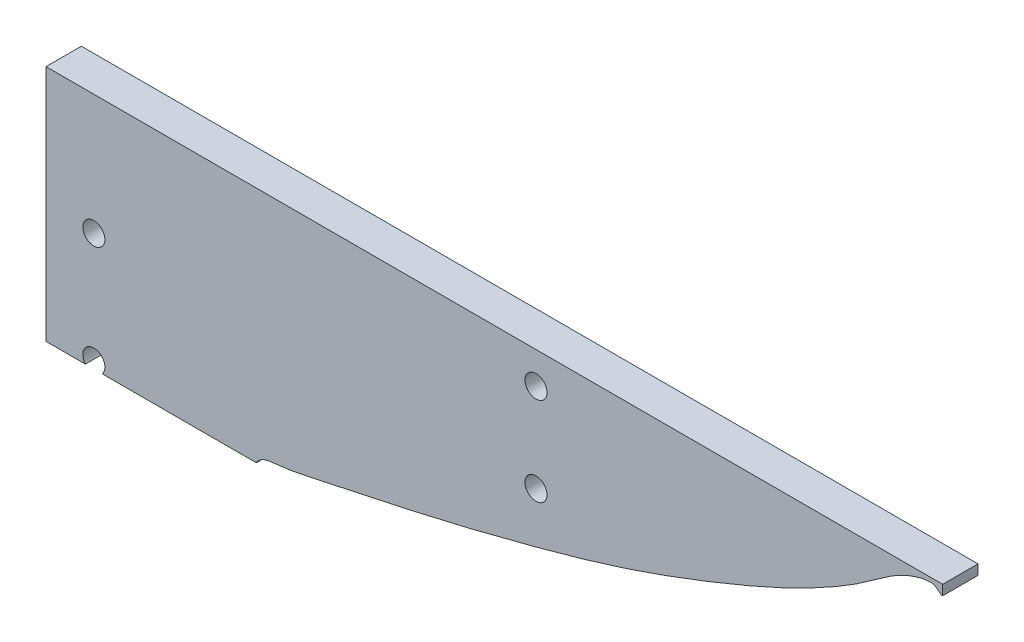
ISO-10303-21;
HEADER;
FILE_DESCRIPTION(('STEP AP214'),'2;1');
FILE_NAME('part.step','',(''),(''),'','','');
FILE_SCHEMA(('AUTOMOTIVE_DESIGN { 1 0 10303 214 1 1 1 1 }'));
ENDSEC;
DATA;
#1=APPLICATION_CONTEXT('core data for automotive mechanical design processes');
#2=APPLICATION_PROTOCOL_DEFINITION('international standard','automotive_design',2000,#1);
#3=PRODUCT_CONTEXT('',#1,'mechanical');
#4=PRODUCT('Part','Part','',(#3));
#5=PRODUCT_RELATED_PRODUCT_CATEGORY('part','',(#4));
#6=PRODUCT_DEFINITION_FORMATION('','',#4);
#7=PRODUCT_DEFINITION_CONTEXT('part definition',#1,'design');
#8=PRODUCT_DEFINITION('design','',#6,#7);
#9=PRODUCT_DEFINITION_SHAPE('','',#8);
#10=(LENGTH_UNIT() NAMED_UNIT(*) SI_UNIT(.MILLI.,.METRE.));
#11=(NAMED_UNIT(*) PLANE_ANGLE_UNIT() SI_UNIT($,.RADIAN.));
#12=(NAMED_UNIT(*) SI_UNIT($,.STERADIAN.) SOLID_ANGLE_UNIT());
#13=UNCERTAINTY_MEASURE_WITH_UNIT(LENGTH_MEASURE(1.E-05),#10,'distance_accuracy_value','');
#14=(GEOMETRIC_REPRESENTATION_CONTEXT(3) GLOBAL_UNCERTAINTY_ASSIGNED_CONTEXT((#13)) GLOBAL_UNIT_ASSIGNED_CONTEXT((#10,
#11,#12)) REPRESENTATION_CONTEXT('',''));
#15=CARTESIAN_POINT('',(0.,0.,0.));
#16=DIRECTION('',(0.,0.,1.));
#17=DIRECTION('',(1.,0.,0.));
#18=AXIS2_PLACEMENT_3D('',#15,#16,#17);
#19=CARTESIAN_POINT('',(-87.028197961204,-51.6048276457291,260.));
#20=DIRECTION('',(0.,0.,-1.));
#21=DIRECTION('',(-1.,0.,0.));
#22=AXIS2_PLACEMENT_3D('',#19,#20,#21);
#23=PLANE('',#22);
#24=CARTESIAN_POINT('',(-100.,-50.,260.));
#25=DIRECTION('',(0.,0.,-1.));
#26=DIRECTION('',(-1.,0.,0.));
#27=AXIS2_PLACEMENT_3D('',#24,#25,#26);
#28=CIRCLE('',#27,2.5);
#29=CARTESIAN_POINT('',(-98.0849112215277,-51.6069956348944,260.));
#30=VERTEX_POINT('',#29);
#31=CARTESIAN_POINT('',(-101.91457817784,-51.6076039316129,260.));
#32=VERTEX_POINT('',#31);
#33=EDGE_CURVE('E222',#30,#32,#28,.F.);
#34=ORIENTED_EDGE('',*,*,#33,.F.);
#35=CARTESIAN_POINT('',(-63.2262085532245,-51.5980104931115,260.));
#36=CARTESIAN_POINT('',(-74.8457757672819,-51.6020791355555,260.));
#37=CARTESIAN_POINT('',(-86.465343423859,-51.6050390694966,260.));
#38=CARTESIAN_POINT('',(-98.0849112215278,-51.6069956348944,260.));
#39=B_SPLINE_CURVE_WITH_KNOTS('',3,(#35,#36,#37,#38),.UNSPECIFIED.,.F.,.F.,(4,4),
(0.26773552809781,1.),.UNSPECIFIED.);
#40=CARTESIAN_POINT('',(-63.2262085532245,-51.5980104931116,260.));
#41=VERTEX_POINT('',#40);
#42=EDGE_CURVE('E92',#30,#41,#39,.F.);
#43=ORIENTED_EDGE('',*,*,#42,.T.);
#44=CARTESIAN_POINT('',(91.7134641857377,0.,260.));
#45=CARTESIAN_POINT('',(91.6739464424342,0.103891483513842,260.));
#46=CARTESIAN_POINT('',(91.6030530432494,0.19046475231935,260.));
#47=CARTESIAN_POINT('',(91.4413761374184,0.340754423127954,260.));
#48=CARTESIAN_POINT('',(91.3539690566634,0.40751930261912,260.));
#49=CARTESIAN_POINT('',(91.0926979811175,0.609026120472222,260.));
#50=CARTESIAN_POINT('',(90.9225274643649,0.748862473622088,260.));
#51=CARTESIAN_POINT('',(90.6472671820136,0.931923860189508,260.));
#52=CARTESIAN_POINT('',(90.5536159016171,0.988854482946531,260.));
#53=CARTESIAN_POINT('',(90.3593347343963,1.08767695540673,260.));
#54=CARTESIAN_POINT('',(90.2583425238152,1.12878800384091,260.));
#55=CARTESIAN_POINT('',(90.0490616306115,1.19528633289628,260.));
#56=CARTESIAN_POINT('',(89.9405661951721,1.22074497060476,260.));
#57=CARTESIAN_POINT('',(89.7244468517773,1.25764457959443,260.));
#58=CARTESIAN_POINT('',(89.6158998023079,1.26945087828814,260.));
#59=CARTESIAN_POINT('',(89.2892142865434,1.29063387566933,260.));
#60=CARTESIAN_POINT('',(89.0693504045242,1.28630013362828,260.));
#61=CARTESIAN_POINT('',(88.631433409586,1.25749846810512,260.));
#62=CARTESIAN_POINT('',(88.4145392229268,1.23401286856385,260.));
#63=CARTESIAN_POINT('',(87.7690420817859,1.14073570754212,260.));
#64=CARTESIAN_POINT('',(87.3458140007802,1.04729001812511,260.));
#65=CARTESIAN_POINT('',(86.0863402573712,0.722017852311709,260.));
#66=CARTESIAN_POINT('',(85.2562425151853,0.441449521729075,260.));
#67=CARTESIAN_POINT('',(83.6481350477826,-0.203365188055209,260.));
#68=CARTESIAN_POINT('',(82.8692567246027,-0.570148040225835,260.));
#69=CARTESIAN_POINT('',(80.6064656967652,-1.80065779634294,260.));
#70=CARTESIAN_POINT('',(79.1928614615302,-2.78831409126646,260.));
#71=CARTESIAN_POINT('',(77.0900225463723,-4.30076381951832,260.));
#72=CARTESIAN_POINT('',(76.3914550882304,-4.80898849847708,260.));
#73=CARTESIAN_POINT('',(74.9842721912353,-5.80862234048741,260.));
#74=CARTESIAN_POINT('',(74.2768349563353,-6.30204449730304,260.));
#75=CARTESIAN_POINT('',(72.1332837514,-7.74699397889696,260.));
#76=CARTESIAN_POINT('',(70.6749543863323,-8.66158159934927,260.));
#77=CARTESIAN_POINT('',(67.7178881825146,-10.4235673922064,260.));
#78=CARTESIAN_POINT('',(66.2196216910429,-11.2717476569108,260.));
#79=CARTESIAN_POINT('',(63.1942093807266,-12.9200877116565,260.));
#80=CARTESIAN_POINT('',(61.6666717164826,-13.7195959421294,260.));
#81=CARTESIAN_POINT('',(58.581433660075,-15.2684578931332,260.));
#82=CARTESIAN_POINT('',(57.0259876991851,-16.0175941052132,260.));
#83=CARTESIAN_POINT('',(52.3329781462771,-18.2043985011206,260.));
#84=CARTESIAN_POINT('',(49.1681178680992,-19.5859121901906,260.));
#85=CARTESIAN_POINT('',(42.8000335315074,-22.2532392835173,260.));
#86=CARTESIAN_POINT('',(39.5944999806741,-23.53689781976,260.));
#87=CARTESIAN_POINT('',(33.1541750545601,-26.0217336995285,260.));
#88=CARTESIAN_POINT('',(29.9191599973454,-27.2237350861042,260.));
#89=CARTESIAN_POINT('',(23.4092713829808,-29.5192757838538,260.));
#90=CARTESIAN_POINT('',(20.1324555363537,-30.6107750833697,260.));
#91=CARTESIAN_POINT('',(13.544705226761,-32.6734791978521,260.));
#92=CARTESIAN_POINT('',(10.2335339088941,-33.6465074750543,260.));
#93=CARTESIAN_POINT('',(3.5892640236653,-35.5186239266044,260.));
#94=CARTESIAN_POINT('',(0.256387473746047,-36.4193739163161,260.));
#95=CARTESIAN_POINT('',(-6.419257992223,-38.1794968017537,260.));
#96=CARTESIAN_POINT('',(-9.76279198488541,-39.0371719798838,260.));
#97=CARTESIAN_POINT('',(-16.4634712857441,-40.6991704438949,260.));
#98=CARTESIAN_POINT('',(-19.8212065563711,-41.5018965512231,260.));
#99=CARTESIAN_POINT('',(-26.5487796833511,-43.0536357719435,260.));
#100=CARTESIAN_POINT('',(-29.9186054502261,-43.8034502558938,260.));
#101=CARTESIAN_POINT('',(-36.664471298233,-45.2743519875925,260.));
#102=CARTESIAN_POINT('',(-40.0397743043765,-45.9988914847141,260.));
#103=CARTESIAN_POINT('',(-45.1041070849526,-47.0791965974909,260.));
#104=CARTESIAN_POINT('',(-46.7923952221232,-47.4384618119304,260.));
#105=CARTESIAN_POINT('',(-49.3264066766367,-47.9698295302068,260.));
#106=CARTESIAN_POINT('',(-50.17134566307,-48.1456727833046,260.));
#107=CARTESIAN_POINT('',(-51.8616670719468,-48.495246466278,260.));
#108=CARTESIAN_POINT('',(-52.7066315244318,-48.6713926532241,260.));
#109=CARTESIAN_POINT('',(-54.3994853467697,-49.0069767528986,260.));
#110=CARTESIAN_POINT('',(-55.2478597006586,-49.1637018211033,260.));
#111=CARTESIAN_POINT('',(-56.5273696693175,-49.3593026477525,260.));
#112=CARTESIAN_POINT('',(-56.9550554959512,-49.4181743791427,260.));
#113=CARTESIAN_POINT('',(-57.8125457692077,-49.522082594865,260.));
#114=CARTESIAN_POINT('',(-58.2425711417196,-49.5644346474761,260.));
#115=CARTESIAN_POINT('',(-59.1030843720913,-49.6456700092286,260.));
#116=CARTESIAN_POINT('',(-59.533142212078,-49.6877785485227,260.));
#117=CARTESIAN_POINT('',(-60.1742293815287,-49.7809391803092,260.));
#118=CARTESIAN_POINT('',(-60.3872778941007,-49.8168469482213,260.));
#119=CARTESIAN_POINT('',(-60.8112561337175,-49.90455384903,260.));
#120=CARTESIAN_POINT('',(-61.0234256230244,-49.9571878174233,260.));
#121=CARTESIAN_POINT('',(-61.4352933697284,-50.0896447571127,260.));
#122=CARTESIAN_POINT('',(-61.6350937330059,-50.1693926432256,260.));
#123=CARTESIAN_POINT('',(-62.0166358756011,-50.3686929500158,260.));
#124=CARTESIAN_POINT('',(-62.1984209441338,-50.4924155430331,260.));
#125=CARTESIAN_POINT('',(-62.5385034036634,-50.7664367819546,260.));
#126=CARTESIAN_POINT('',(-62.6958232643753,-50.9174820919135,260.));
#127=CARTESIAN_POINT('',(-62.928861666123,-51.147295107646,260.));
#128=CARTESIAN_POINT('',(-63.0057656263848,-51.2257561659629,260.));
#129=CARTESIAN_POINT('',(-63.1421914620176,-51.3961720440688,260.));
#130=CARTESIAN_POINT('',(-63.2004170595864,-51.4919148575546,260.));
#131=CARTESIAN_POINT('',(-63.2262085532245,-51.5980104931116,260.));
#132=B_SPLINE_CURVE_WITH_KNOTS('',3,(#44,#45,#46,#47,#48,#49,#50,#51,#52,#53,#54,#55,#56,#57,
#58,#59,#60,#61,#62,#63,#64,#65,#66,#67,#68,#69,#70,#71,#72,#73,#74,#75,#76,#77,#78,#79,#80,#81,
#82,#83,#84,#85,#86,#87,#88,#89,#90,#91,#92,#93,#94,#95,#96,#97,#98,#99,#100,#101,#102,#103,
#104,#105,#106,#107,#108,#109,#110,#111,#112,#113,#114,#115,#116,#117,#118,#119,#120,#121,#122,
#123,#124,#125,#126,#127,#128,#129,#130,#131),.UNSPECIFIED.,.F.,.F.,(4,2,2,2,2,2,2,2,2,2,2,2,2,
2,2,2,2,2,2,2,2,2,2,2,2,2,2,2,2,2,2,2,2,2,2,2,2,2,2,2,2,2,2,4),(0.,0.00195312499999989,
0.00390624999999978,0.00781249999999967,0.00976562499999956,0.0117187499999994,
0.0136718749999994,0.0156249999999993,0.0195312499999994,0.0234374999999994,0.0312499999999997,
0.046875,0.0625000000000002,0.0937500000000007,0.109375000000001,0.125000000000001,
0.156250000000001,0.187500000000001,0.218750000000001,0.250000000000001,0.312500000000001,
0.375000000000001,0.437500000000001,0.500000000000001,0.562500000000001,0.625000000000001,
0.687500000000001,0.750000000000001,0.812500000000001,0.875000000000001,0.906250000000001,
0.921875000000001,0.937500000000001,0.953125,0.9609375,0.96875,0.9765625,0.98046875,0.984375,
0.98828125,0.9921875,0.99609375,0.998046875,1.),.UNSPECIFIED.);
#133=CARTESIAN_POINT('',(91.7134641857364,0.,260.));
#134=VERTEX_POINT('',#133);
#135=EDGE_CURVE('E139',#41,#134,#132,.F.);
#136=ORIENTED_EDGE('',*,*,#135,.T.);
#137=DIRECTION('',(1.,1.38819830559158E-13,0.));
#138=VECTOR('',#137,1.);
#139=CARTESIAN_POINT('',(91.7134641857364,0.,260.));
#140=LINE('',#139,#138);
#141=CARTESIAN_POINT('',(92.1145636367041,0.,260.));
#142=VERTEX_POINT('',#141);
#143=EDGE_CURVE('E110',#134,#142,#140,.T.);
#144=ORIENTED_EDGE('',*,*,#143,.T.);
#145=DIRECTION('',(0.,1.,0.));
#146=VECTOR('',#145,1.);
#147=CARTESIAN_POINT('',(92.1145636367041,2.25600000000004,260.));
#148=LINE('',#147,#146);
#149=CARTESIAN_POINT('',(92.1145636367041,2.25600000000004,260.));
#150=VERTEX_POINT('',#149);
#151=EDGE_CURVE('E103',#142,#150,#148,.T.);
#152=ORIENTED_EDGE('',*,*,#151,.T.);
#153=DIRECTION('',(-1.,0.,0.));
#154=VECTOR('',#153,1.);
#155=CARTESIAN_POINT('',(92.1145636367041,2.25600000000004,260.));
#156=LINE('',#155,#154);
#157=CARTESIAN_POINT('',(-110.830188031331,2.25600000000002,260.));
#158=VERTEX_POINT('',#157);
#159=EDGE_CURVE('E107',#150,#158,#156,.T.);
#160=ORIENTED_EDGE('',*,*,#159,.T.);
#161=DIRECTION('',(0.,-1.,0.));
#162=VECTOR('',#161,1.);
#163=CARTESIAN_POINT('',(-110.830188031331,-51.6087445021867,260.));
#164=LINE('',#163,#162);
#165=CARTESIAN_POINT('',(-110.830188031331,-51.6087445021867,260.));
#166=VERTEX_POINT('',#165);
#167=EDGE_CURVE('E57',#158,#166,#164,.T.);
#168=ORIENTED_EDGE('',*,*,#167,.T.);
#169=CARTESIAN_POINT('',(-101.914577865878,-51.6076043031451,260.));
#170=CARTESIAN_POINT('',(-104.886447915647,-51.608048660674,260.));
#171=CARTESIAN_POINT('',(-107.858317972479,-51.6084281395435,260.));
#172=CARTESIAN_POINT('',(-110.830188031331,-51.6087445021867,260.));
#173=B_SPLINE_CURVE_WITH_KNOTS('',3,(#169,#170,#171,#172),.UNSPECIFIED.,.F.,.F.,(4,4),(0.,
0.187287073437251),.UNSPECIFIED.);
#174=EDGE_CURVE('E237',#166,#32,#173,.F.);
#175=ORIENTED_EDGE('',*,*,#174,.T.);
#176=EDGE_LOOP('',(#34,#43,#136,#144,#152,#160,#168,#175));
#177=FACE_BOUND('',#176,.T.);
#178=CARTESIAN_POINT('',(0.0705666698621599,-4.96037406111782,260.));
#179=DIRECTION('',(0.,0.,-1.));
#180=DIRECTION('',(-1.,0.,0.));
#181=AXIS2_PLACEMENT_3D('',#178,#179,#180);
#182=CIRCLE('',#181,2.5);
#183=CARTESIAN_POINT('',(-2.42943333013784,-4.96037406111782,260.));
#184=VERTEX_POINT('',#183);
#185=EDGE_CURVE('E226',#184,#184,#182,.F.);
#186=ORIENTED_EDGE('',*,*,#185,.F.);
#187=EDGE_LOOP('',(#186));
#188=FACE_BOUND('',#187,.T.);
#189=CARTESIAN_POINT('',(0.0705666698621599,-25.,260.));
#190=DIRECTION('',(0.,0.,-1.));
#191=DIRECTION('',(-1.,0.,0.));
#192=AXIS2_PLACEMENT_3D('',#189,#190,#191);
#193=CIRCLE('',#192,2.5);
#194=CARTESIAN_POINT('',(-2.42943333013784,-25.,260.));
#195=VERTEX_POINT('',#194);
#196=EDGE_CURVE('E221',#195,#195,#193,.F.);
#197=ORIENTED_EDGE('',*,*,#196,.F.);
#198=EDGE_LOOP('',(#197));
#199=FACE_BOUND('',#198,.T.);
#200=CARTESIAN_POINT('',(-100.,-25.,260.));
#201=DIRECTION('',(0.,0.,-1.));
#202=DIRECTION('',(-1.,0.,0.));
#203=AXIS2_PLACEMENT_3D('',#200,#201,#202);
#204=CIRCLE('',#203,2.5);
#205=CARTESIAN_POINT('',(-102.5,-25.,260.));
#206=VERTEX_POINT('',#205);
#207=EDGE_CURVE('E291',#206,#206,#204,.F.);
#208=ORIENTED_EDGE('',*,*,#207,.F.);
#209=EDGE_LOOP('',(#208));
#210=FACE_BOUND('',#209,.T.);
#211=ADVANCED_FACE('F30',(#177,#188,#199,#210),#23,.F.);
#212=CARTESIAN_POINT('',(-87.028197961204,-51.6048276457291,252.));
#213=DIRECTION('',(0.,0.,-1.));
#214=DIRECTION('',(-1.,0.,0.));
#215=AXIS2_PLACEMENT_3D('',#212,#213,#214);
#216=PLANE('',#215);
#217=CARTESIAN_POINT('',(-98.0849112215278,-51.6069956348944,252.));
#218=CARTESIAN_POINT('',(-86.465343423859,-51.6050390694966,252.));
#219=CARTESIAN_POINT('',(-74.8457757672819,-51.6020791355555,252.));
#220=CARTESIAN_POINT('',(-63.2262085532245,-51.5980104931115,252.));
#221=B_SPLINE_CURVE_WITH_KNOTS('',3,(#217,#218,#219,#220),.UNSPECIFIED.,.F.,.F.,(4,4),
(0.26773552809781,1.),.UNSPECIFIED.);
#222=CARTESIAN_POINT('',(-98.0849112215794,-51.6069953286277,252.));
#223=VERTEX_POINT('',#222);
#224=CARTESIAN_POINT('',(-63.2262085532245,-51.5980104931116,252.));
#225=VERTEX_POINT('',#224);
#226=EDGE_CURVE('E216',#223,#225,#221,.T.);
#227=ORIENTED_EDGE('',*,*,#226,.F.);
#228=CARTESIAN_POINT('',(-100.,-50.,252.));
#229=DIRECTION('',(0.,0.,-1.));
#230=DIRECTION('',(-1.,0.,0.));
#231=AXIS2_PLACEMENT_3D('',#228,#229,#230);
#232=CIRCLE('',#231,2.5);
#233=CARTESIAN_POINT('',(-101.91457817784,-51.6076039316129,252.));
#234=VERTEX_POINT('',#233);
#235=EDGE_CURVE('E48',#223,#234,#232,.F.);
#236=ORIENTED_EDGE('',*,*,#235,.T.);
#237=CARTESIAN_POINT('',(-110.830188031331,-51.6087445021867,252.));
#238=CARTESIAN_POINT('',(-107.858317972479,-51.6084281395435,252.));
#239=CARTESIAN_POINT('',(-104.886447915647,-51.608048660674,252.));
#240=CARTESIAN_POINT('',(-101.914577865878,-51.6076043031451,252.));
#241=B_SPLINE_CURVE_WITH_KNOTS('',3,(#237,#238,#239,#240),.UNSPECIFIED.,.F.,.F.,(4,4),(0.,
0.187287073437252),.UNSPECIFIED.);
#242=CARTESIAN_POINT('',(-110.830188031331,-51.6087445021867,252.));
#243=VERTEX_POINT('',#242);
#244=EDGE_CURVE('E205',#243,#234,#241,.T.);
#245=ORIENTED_EDGE('',*,*,#244,.F.);
#246=DIRECTION('',(0.,-1.,0.));
#247=VECTOR('',#246,1.);
#248=CARTESIAN_POINT('',(-110.830188031331,-51.6087445021867,252.));
#249=LINE('',#248,#247);
#250=CARTESIAN_POINT('',(-110.830188031331,2.25600000000002,252.));
#251=VERTEX_POINT('',#250);
#252=EDGE_CURVE('E84',#251,#243,#249,.T.);
#253=ORIENTED_EDGE('',*,*,#252,.F.);
#254=DIRECTION('',(-1.,0.,0.));
#255=VECTOR('',#254,1.);
#256=CARTESIAN_POINT('',(92.1145636367041,2.25600000000004,252.));
#257=LINE('',#256,#255);
#258=CARTESIAN_POINT('',(92.1145636367041,2.25600000000004,252.));
#259=VERTEX_POINT('',#258);
#260=EDGE_CURVE('E132',#259,#251,#257,.T.);
#261=ORIENTED_EDGE('',*,*,#260,.F.);
#262=DIRECTION('',(0.,1.,0.));
#263=VECTOR('',#262,1.);
#264=CARTESIAN_POINT('',(92.1145636367041,2.25600000000004,252.));
#265=LINE('',#264,#263);
#266=CARTESIAN_POINT('',(92.1145636367041,0.,252.));
#267=VERTEX_POINT('',#266);
#268=EDGE_CURVE('E119',#267,#259,#265,.T.);
#269=ORIENTED_EDGE('',*,*,#268,.F.);
#270=DIRECTION('',(1.,1.38819830559158E-13,0.));
#271=VECTOR('',#270,1.);
#272=CARTESIAN_POINT('',(91.7134641857364,0.,252.));
#273=LINE('',#272,#271);
#274=CARTESIAN_POINT('',(91.7134641857364,0.,252.));
#275=VERTEX_POINT('',#274);
#276=EDGE_CURVE('E133',#275,#267,#273,.T.);
#277=ORIENTED_EDGE('',*,*,#276,.F.);
#278=CARTESIAN_POINT('',(-63.2262085532245,-51.5980104931116,252.));
#279=CARTESIAN_POINT('',(-63.2004170595864,-51.4919148575546,252.));
#280=CARTESIAN_POINT('',(-63.1421914620176,-51.3961720440688,252.));
#281=CARTESIAN_POINT('',(-63.0057656263848,-51.2257561659629,252.));
#282=CARTESIAN_POINT('',(-62.928861666123,-51.147295107646,252.));
#283=CARTESIAN_POINT('',(-62.6958232643753,-50.9174820919135,252.));
#284=CARTESIAN_POINT('',(-62.5385034036634,-50.7664367819546,252.));
#285=CARTESIAN_POINT('',(-62.1984209441338,-50.4924155430331,252.));
#286=CARTESIAN_POINT('',(-62.0166358756011,-50.3686929500158,252.));
#287=CARTESIAN_POINT('',(-61.6350937330059,-50.1693926432256,252.));
#288=CARTESIAN_POINT('',(-61.4352933697284,-50.0896447571127,252.));
#289=CARTESIAN_POINT('',(-61.0234256230244,-49.9571878174233,252.));
#290=CARTESIAN_POINT('',(-60.8112561337175,-49.90455384903,252.));
#291=CARTESIAN_POINT('',(-60.3872778941007,-49.8168469482213,252.));
#292=CARTESIAN_POINT('',(-60.1742293815287,-49.7809391803092,252.));
#293=CARTESIAN_POINT('',(-59.533142212078,-49.6877785485227,252.));
#294=CARTESIAN_POINT('',(-59.1030843720913,-49.6456700092286,252.));
#295=CARTESIAN_POINT('',(-58.2425711417196,-49.5644346474761,252.));
#296=CARTESIAN_POINT('',(-57.8125457692077,-49.522082594865,252.));
#297=CARTESIAN_POINT('',(-56.9550554959512,-49.4181743791427,252.));
#298=CARTESIAN_POINT('',(-56.5273696693175,-49.3593026477525,252.));
#299=CARTESIAN_POINT('',(-55.2478597006586,-49.1637018211033,252.));
#300=CARTESIAN_POINT('',(-54.3994853467697,-49.0069767528986,252.));
#301=CARTESIAN_POINT('',(-52.7066315244318,-48.6713926532241,252.));
#302=CARTESIAN_POINT('',(-51.8616670719468,-48.495246466278,252.));
#303=CARTESIAN_POINT('',(-50.17134566307,-48.1456727833046,252.));
#304=CARTESIAN_POINT('',(-49.3264066766367,-47.9698295302068,252.));
#305=CARTESIAN_POINT('',(-46.7923952221232,-47.4384618119304,252.));
#306=CARTESIAN_POINT('',(-45.1041070849526,-47.0791965974909,252.));
#307=CARTESIAN_POINT('',(-40.0397743043765,-45.9988914847141,252.));
#308=CARTESIAN_POINT('',(-36.664471298233,-45.2743519875925,252.));
#309=CARTESIAN_POINT('',(-29.9186054502261,-43.8034502558938,252.));
#310=CARTESIAN_POINT('',(-26.5487796833511,-43.0536357719435,252.));
#311=CARTESIAN_POINT('',(-19.8212065563711,-41.5018965512231,252.));
#312=CARTESIAN_POINT('',(-16.4634712857441,-40.6991704438949,252.));
#313=CARTESIAN_POINT('',(-9.76279198488541,-39.0371719798838,252.));
#314=CARTESIAN_POINT('',(-6.419257992223,-38.1794968017537,252.));
#315=CARTESIAN_POINT('',(0.256387473746047,-36.4193739163161,252.));
#316=CARTESIAN_POINT('',(3.5892640236653,-35.5186239266044,252.));
#317=CARTESIAN_POINT('',(10.2335339088941,-33.6465074750543,252.));
#318=CARTESIAN_POINT('',(13.544705226761,-32.6734791978521,252.));
#319=CARTESIAN_POINT('',(20.1324555363537,-30.6107750833697,252.));
#320=CARTESIAN_POINT('',(23.4092713829808,-29.5192757838538,252.));
#321=CARTESIAN_POINT('',(29.9191599973454,-27.2237350861042,252.));
#322=CARTESIAN_POINT('',(33.1541750545601,-26.0217336995285,252.));
#323=CARTESIAN_POINT('',(39.5944999806741,-23.53689781976,252.));
#324=CARTESIAN_POINT('',(42.8000335315074,-22.2532392835173,252.));
#325=CARTESIAN_POINT('',(49.1681178680992,-19.5859121901906,252.));
#326=CARTESIAN_POINT('',(52.3329781462771,-18.2043985011206,252.));
#327=CARTESIAN_POINT('',(57.0259876991851,-16.0175941052132,252.));
#328=CARTESIAN_POINT('',(58.581433660075,-15.2684578931332,252.));
#329=CARTESIAN_POINT('',(61.6666717164826,-13.7195959421294,252.));
#330=CARTESIAN_POINT('',(63.1942093807266,-12.9200877116565,252.));
#331=CARTESIAN_POINT('',(66.2196216910429,-11.2717476569108,252.));
#332=CARTESIAN_POINT('',(67.7178881825146,-10.4235673922064,252.));
#333=CARTESIAN_POINT('',(70.6749543863323,-8.66158159934927,252.));
#334=CARTESIAN_POINT('',(72.1332837514,-7.74699397889696,252.));
#335=CARTESIAN_POINT('',(74.2768349563353,-6.30204449730304,252.));
#336=CARTESIAN_POINT('',(74.9842721912353,-5.80862234048741,252.));
#337=CARTESIAN_POINT('',(76.3914550882304,-4.80898849847708,252.));
#338=CARTESIAN_POINT('',(77.0900225463723,-4.30076381951832,252.));
#339=CARTESIAN_POINT('',(79.1928614615302,-2.78831409126646,252.));
#340=CARTESIAN_POINT('',(80.6064656967652,-1.80065779634294,252.));
#341=CARTESIAN_POINT('',(82.8692567246027,-0.570148040225835,252.));
#342=CARTESIAN_POINT('',(83.6481350477826,-0.203365188055209,252.));
#343=CARTESIAN_POINT('',(85.2562425151853,0.441449521729075,252.));
#344=CARTESIAN_POINT('',(86.0863402573712,0.722017852311709,252.));
#345=CARTESIAN_POINT('',(87.3458140007802,1.04729001812511,252.));
#346=CARTESIAN_POINT('',(87.7690420817859,1.14073570754212,252.));
#347=CARTESIAN_POINT('',(88.4145392229268,1.23401286856385,252.));
#348=CARTESIAN_POINT('',(88.631433409586,1.25749846810512,252.));
#349=CARTESIAN_POINT('',(89.0693504045242,1.28630013362828,252.));
#350=CARTESIAN_POINT('',(89.2892142865434,1.29063387566933,252.));
#351=CARTESIAN_POINT('',(89.6158998023079,1.26945087828814,252.));
#352=CARTESIAN_POINT('',(89.7244468517773,1.25764457959443,252.));
#353=CARTESIAN_POINT('',(89.9405661951721,1.22074497060476,252.));
#354=CARTESIAN_POINT('',(90.0490616306115,1.19528633289628,252.));
#355=CARTESIAN_POINT('',(90.2583425238152,1.12878800384091,252.));
#356=CARTESIAN_POINT('',(90.3593347343963,1.08767695540673,252.));
#357=CARTESIAN_POINT('',(90.5536159016171,0.988854482946531,252.));
#358=CARTESIAN_POINT('',(90.6472671820136,0.931923860189508,252.));
#359=CARTESIAN_POINT('',(90.9225274643649,0.748862473622088,252.));
#360=CARTESIAN_POINT('',(91.0926979811175,0.609026120472222,252.));
#361=CARTESIAN_POINT('',(91.3539690566634,0.40751930261912,252.));
#362=CARTESIAN_POINT('',(91.4413761374184,0.340754423127954,252.));
#363=CARTESIAN_POINT('',(91.6030530432494,0.19046475231935,252.));
#364=CARTESIAN_POINT('',(91.6739464424342,0.103891483513842,252.));
#365=CARTESIAN_POINT('',(91.7134641857377,0.,252.));
#366=B_SPLINE_CURVE_WITH_KNOTS('',3,(#278,#279,#280,#281,#282,#283,#284,#285,#286,#287,#288,
#289,#290,#291,#292,#293,#294,#295,#296,#297,#298,#299,#300,#301,#302,#303,#304,#305,#306,#307,
#308,#309,#310,#311,#312,#313,#314,#315,#316,#317,#318,#319,#320,#321,#322,#323,#324,#325,#326,
#327,#328,#329,#330,#331,#332,#333,#334,#335,#336,#337,#338,#339,#340,#341,#342,#343,#344,#345,
#346,#347,#348,#349,#350,#351,#352,#353,#354,#355,#356,#357,#358,#359,#360,#361,#362,#363,#364,
#365),.UNSPECIFIED.,.F.,.F.,(4,2,2,2,2,2,2,2,2,2,2,2,2,2,2,2,2,2,2,2,2,2,2,2,2,2,2,2,2,2,2,2,2,
2,2,2,2,2,2,2,2,2,2,4),(0.,0.00195312499999989,0.00390624999999978,0.00781249999999978,
0.0117187499999997,0.0156249999999997,0.0195312499999996,0.0234374999999996,0.0312499999999996,
0.0390624999999996,0.0468749999999996,0.0624999999999994,0.0781249999999994,0.0937499999999994,
0.124999999999999,0.187499999999999,0.249999999999999,0.312499999999999,0.374999999999999,
0.437499999999999,0.499999999999999,0.562499999999999,0.624999999999999,0.687499999999999,
0.749999999999999,0.781249999999999,0.812499999999999,0.843749999999999,0.874999999999999,
0.890624999999999,0.906249999999999,0.9375,0.953125,0.96875,0.976562500000001,0.980468750000001,
0.984375000000001,0.986328125000001,0.988281250000001,0.990234375,0.9921875,0.99609375,
0.998046875,1.),.UNSPECIFIED.);
#367=EDGE_CURVE('E248',#225,#275,#366,.T.);
#368=ORIENTED_EDGE('',*,*,#367,.F.);
#369=EDGE_LOOP('',(#227,#236,#245,#253,#261,#269,#277,#368));
#370=FACE_BOUND('',#369,.T.);
#371=CARTESIAN_POINT('',(0.0705666698621599,-4.96037406111782,252.));
#372=DIRECTION('',(0.,0.,-1.));
#373=DIRECTION('',(-1.,0.,0.));
#374=AXIS2_PLACEMENT_3D('',#371,#372,#373);
#375=CIRCLE('',#374,2.5);
#376=CARTESIAN_POINT('',(-2.42943333013784,-4.96037406111782,252.));
#377=VERTEX_POINT('',#376);
#378=EDGE_CURVE('E223',#377,#377,#375,.F.);
#379=ORIENTED_EDGE('',*,*,#378,.T.);
#380=EDGE_LOOP('',(#379));
#381=FACE_BOUND('',#380,.T.);
#382=CARTESIAN_POINT('',(0.0705666698621599,-25.,252.));
#383=DIRECTION('',(0.,0.,-1.));
#384=DIRECTION('',(-1.,0.,0.));
#385=AXIS2_PLACEMENT_3D('',#382,#383,#384);
#386=CIRCLE('',#385,2.5);
#387=CARTESIAN_POINT('',(-2.42943333013784,-25.,252.));
#388=VERTEX_POINT('',#387);
#389=EDGE_CURVE('E218',#388,#388,#386,.F.);
#390=ORIENTED_EDGE('',*,*,#389,.T.);
#391=EDGE_LOOP('',(#390));
#392=FACE_BOUND('',#391,.T.);
#393=CARTESIAN_POINT('',(-100.,-25.,252.));
#394=DIRECTION('',(0.,0.,-1.));
#395=DIRECTION('',(-1.,0.,0.));
#396=AXIS2_PLACEMENT_3D('',#393,#394,#395);
#397=CIRCLE('',#396,2.5);
#398=CARTESIAN_POINT('',(-102.5,-25.,252.));
#399=VERTEX_POINT('',#398);
#400=EDGE_CURVE('E36',#399,#399,#397,.F.);
#401=ORIENTED_EDGE('',*,*,#400,.T.);
#402=EDGE_LOOP('',(#401));
#403=FACE_BOUND('',#402,.T.);
#404=ADVANCED_FACE('F155',(#370,#381,#392,#403),#216,.T.);
#405=CARTESIAN_POINT('',(-110.830188031331,-51.6087445021867,260.));
#406=CARTESIAN_POINT('',(-94.9621945584771,-51.607055316503,260.));
#407=CARTESIAN_POINT('',(-79.0942011432151,-51.6035667403419,260.));
#408=CARTESIAN_POINT('',(-63.2262085532245,-51.5980104931115,260.));
#409=B_SPLINE_CURVE_WITH_KNOTS('',3,(#405,#406,#407,#408),.UNSPECIFIED.,.F.,.F.,(4,4),(0.,1.),.UNSPECIFIED.);
#410=DIRECTION('',(0.,0.,-1.));
#411=VECTOR('',#410,1.);
#412=SURFACE_OF_LINEAR_EXTRUSION('',#409,#411);
#413=DIRECTION('',(0.,0.,-1.));
#414=VECTOR('',#413,1.);
#415=CARTESIAN_POINT('',(-101.914577865878,-51.607604303145,260.));
#416=LINE('',#415,#414);
#417=EDGE_CURVE('E11',#32,#234,#416,.T.);
#418=ORIENTED_EDGE('',*,*,#417,.F.);
#419=ORIENTED_EDGE('',*,*,#174,.F.);
#420=DIRECTION('',(0.,0.,-1.));
#421=VECTOR('',#420,1.);
#422=CARTESIAN_POINT('',(-110.830188031331,-51.6087445021867,260.));
#423=LINE('',#422,#421);
#424=EDGE_CURVE('E127',#166,#243,#423,.T.);
#425=ORIENTED_EDGE('',*,*,#424,.T.);
#426=ORIENTED_EDGE('',*,*,#244,.T.);
#427=EDGE_LOOP('',(#418,#419,#425,#426));
#428=FACE_BOUND('',#427,.T.);
#429=ADVANCED_FACE('F32',(#428),#412,.F.);
#430=DIRECTION('',(0.,0.,-1.));
#431=VECTOR('',#430,1.);
#432=CARTESIAN_POINT('',(-98.0849112215277,-51.6069956348944,260.));
#433=LINE('',#432,#431);
#434=EDGE_CURVE('E41',#223,#30,#433,.F.);
#435=ORIENTED_EDGE('',*,*,#434,.F.);
#436=ORIENTED_EDGE('',*,*,#226,.T.);
#437=DIRECTION('',(0.,0.,-1.));
#438=VECTOR('',#437,1.);
#439=CARTESIAN_POINT('',(-63.2262085532245,-51.5980104931116,260.));
#440=LINE('',#439,#438);
#441=EDGE_CURVE('E342',#41,#225,#440,.T.);
#442=ORIENTED_EDGE('',*,*,#441,.F.);
#443=ORIENTED_EDGE('',*,*,#42,.F.);
#444=EDGE_LOOP('',(#435,#436,#442,#443));
#445=FACE_BOUND('',#444,.T.);
#446=ADVANCED_FACE('F264',(#445),#412,.F.);
#447=CARTESIAN_POINT('',(-63.2262085532245,-51.5980104931116,260.));
#448=CARTESIAN_POINT('',(-63.2004170595864,-51.4919148575546,260.));
#449=CARTESIAN_POINT('',(-63.1421914620176,-51.3961720440688,260.));
#450=CARTESIAN_POINT('',(-63.0057656263848,-51.2257561659629,260.));
#451=CARTESIAN_POINT('',(-62.928861666123,-51.147295107646,260.));
#452=CARTESIAN_POINT('',(-62.6958232643753,-50.9174820919135,260.));
#453=CARTESIAN_POINT('',(-62.5385034036634,-50.7664367819546,260.));
#454=CARTESIAN_POINT('',(-62.1984209441338,-50.4924155430331,260.));
#455=CARTESIAN_POINT('',(-62.0166358756011,-50.3686929500158,260.));
#456=CARTESIAN_POINT('',(-61.6350937330059,-50.1693926432256,260.));
#457=CARTESIAN_POINT('',(-61.4352933697284,-50.0896447571127,260.));
#458=CARTESIAN_POINT('',(-61.0234256230244,-49.9571878174233,260.));
#459=CARTESIAN_POINT('',(-60.8112561337175,-49.90455384903,260.));
#460=CARTESIAN_POINT('',(-60.3872778941007,-49.8168469482213,260.));
#461=CARTESIAN_POINT('',(-60.1742293815287,-49.7809391803092,260.));
#462=CARTESIAN_POINT('',(-59.533142212078,-49.6877785485227,260.));
#463=CARTESIAN_POINT('',(-59.1030843720913,-49.6456700092286,260.));
#464=CARTESIAN_POINT('',(-58.2425711417196,-49.5644346474761,260.));
#465=CARTESIAN_POINT('',(-57.8125457692077,-49.522082594865,260.));
#466=CARTESIAN_POINT('',(-56.9550554959512,-49.4181743791427,260.));
#467=CARTESIAN_POINT('',(-56.5273696693175,-49.3593026477525,260.));
#468=CARTESIAN_POINT('',(-55.2478597006586,-49.1637018211033,260.));
#469=CARTESIAN_POINT('',(-54.3994853467697,-49.0069767528986,260.));
#470=CARTESIAN_POINT('',(-52.7066315244318,-48.6713926532241,260.));
#471=CARTESIAN_POINT('',(-51.8616670719468,-48.495246466278,260.));
#472=CARTESIAN_POINT('',(-50.17134566307,-48.1456727833046,260.));
#473=CARTESIAN_POINT('',(-49.3264066766367,-47.9698295302068,260.));
#474=CARTESIAN_POINT('',(-46.7923952221232,-47.4384618119304,260.));
#475=CARTESIAN_POINT('',(-45.1041070849526,-47.0791965974909,260.));
#476=CARTESIAN_POINT('',(-40.0397743043765,-45.9988914847141,260.));
#477=CARTESIAN_POINT('',(-36.664471298233,-45.2743519875925,260.));
#478=CARTESIAN_POINT('',(-29.9186054502261,-43.8034502558938,260.));
#479=CARTESIAN_POINT('',(-26.5487796833511,-43.0536357719435,260.));
#480=CARTESIAN_POINT('',(-19.8212065563711,-41.5018965512231,260.));
#481=CARTESIAN_POINT('',(-16.4634712857441,-40.6991704438949,260.));
#482=CARTESIAN_POINT('',(-9.76279198488541,-39.0371719798838,260.));
#483=CARTESIAN_POINT('',(-6.419257992223,-38.1794968017537,260.));
#484=CARTESIAN_POINT('',(0.256387473746047,-36.4193739163161,260.));
#485=CARTESIAN_POINT('',(3.5892640236653,-35.5186239266044,260.));
#486=CARTESIAN_POINT('',(10.2335339088941,-33.6465074750543,260.));
#487=CARTESIAN_POINT('',(13.544705226761,-32.6734791978521,260.));
#488=CARTESIAN_POINT('',(20.1324555363537,-30.6107750833697,260.));
#489=CARTESIAN_POINT('',(23.4092713829808,-29.5192757838538,260.));
#490=CARTESIAN_POINT('',(29.9191599973454,-27.2237350861042,260.));
#491=CARTESIAN_POINT('',(33.1541750545601,-26.0217336995285,260.));
#492=CARTESIAN_POINT('',(39.5944999806741,-23.53689781976,260.));
#493=CARTESIAN_POINT('',(42.8000335315074,-22.2532392835173,260.));
#494=CARTESIAN_POINT('',(49.1681178680992,-19.5859121901906,260.));
#495=CARTESIAN_POINT('',(52.3329781462771,-18.2043985011206,260.));
#496=CARTESIAN_POINT('',(57.0259876991851,-16.0175941052132,260.));
#497=CARTESIAN_POINT('',(58.581433660075,-15.2684578931332,260.));
#498=CARTESIAN_POINT('',(61.6666717164826,-13.7195959421294,260.));
#499=CARTESIAN_POINT('',(63.1942093807266,-12.9200877116565,260.));
#500=CARTESIAN_POINT('',(66.2196216910429,-11.2717476569108,260.));
#501=CARTESIAN_POINT('',(67.7178881825146,-10.4235673922064,260.));
#502=CARTESIAN_POINT('',(70.6749543863323,-8.66158159934927,260.));
#503=CARTESIAN_POINT('',(72.1332837514,-7.74699397889696,260.));
#504=CARTESIAN_POINT('',(74.2768349563353,-6.30204449730304,260.));
#505=CARTESIAN_POINT('',(74.9842721912353,-5.80862234048741,260.));
#506=CARTESIAN_POINT('',(76.3914550882304,-4.80898849847708,260.));
#507=CARTESIAN_POINT('',(77.0900225463723,-4.30076381951832,260.));
#508=CARTESIAN_POINT('',(79.1928614615302,-2.78831409126646,260.));
#509=CARTESIAN_POINT('',(80.6064656967652,-1.80065779634294,260.));
#510=CARTESIAN_POINT('',(82.8692567246027,-0.570148040225835,260.));
#511=CARTESIAN_POINT('',(83.6481350477826,-0.203365188055209,260.));
#512=CARTESIAN_POINT('',(85.2562425151853,0.441449521729075,260.));
#513=CARTESIAN_POINT('',(86.0863402573712,0.722017852311709,260.));
#514=CARTESIAN_POINT('',(87.3458140007802,1.04729001812511,260.));
#515=CARTESIAN_POINT('',(87.7690420817859,1.14073570754212,260.));
#516=CARTESIAN_POINT('',(88.4145392229268,1.23401286856385,260.));
#517=CARTESIAN_POINT('',(88.631433409586,1.25749846810512,260.));
#518=CARTESIAN_POINT('',(89.0693504045242,1.28630013362828,260.));
#519=CARTESIAN_POINT('',(89.2892142865434,1.29063387566933,260.));
#520=CARTESIAN_POINT('',(89.6158998023079,1.26945087828814,260.));
#521=CARTESIAN_POINT('',(89.7244468517773,1.25764457959443,260.));
#522=CARTESIAN_POINT('',(89.9405661951721,1.22074497060476,260.));
#523=CARTESIAN_POINT('',(90.0490616306115,1.19528633289628,260.));
#524=CARTESIAN_POINT('',(90.2583425238152,1.12878800384091,260.));
#525=CARTESIAN_POINT('',(90.3593347343963,1.08767695540673,260.));
#526=CARTESIAN_POINT('',(90.5536159016171,0.988854482946531,260.));
#527=CARTESIAN_POINT('',(90.6472671820136,0.931923860189508,260.));
#528=CARTESIAN_POINT('',(90.9225274643649,0.748862473622088,260.));
#529=CARTESIAN_POINT('',(91.0926979811175,0.609026120472222,260.));
#530=CARTESIAN_POINT('',(91.3539690566634,0.40751930261912,260.));
#531=CARTESIAN_POINT('',(91.4413761374184,0.340754423127954,260.));
#532=CARTESIAN_POINT('',(91.6030530432494,0.19046475231935,260.));
#533=CARTESIAN_POINT('',(91.6739464424342,0.103891483513842,260.));
#534=CARTESIAN_POINT('',(91.7134641857377,0.,260.));
#535=B_SPLINE_CURVE_WITH_KNOTS('',3,(#447,#448,#449,#450,#451,#452,#453,#454,#455,#456,#457,
#458,#459,#460,#461,#462,#463,#464,#465,#466,#467,#468,#469,#470,#471,#472,#473,#474,#475,#476,
#477,#478,#479,#480,#481,#482,#483,#484,#485,#486,#487,#488,#489,#490,#491,#492,#493,#494,#495,
#496,#497,#498,#499,#500,#501,#502,#503,#504,#505,#506,#507,#508,#509,#510,#511,#512,#513,#514,
#515,#516,#517,#518,#519,#520,#521,#522,#523,#524,#525,#526,#527,#528,#529,#530,#531,#532,#533,
#534),.UNSPECIFIED.,.F.,.F.,(4,2,2,2,2,2,2,2,2,2,2,2,2,2,2,2,2,2,2,2,2,2,2,2,2,2,2,2,2,2,2,2,2,
2,2,2,2,2,2,2,2,2,2,4),(0.,0.00195312499999989,0.00390624999999978,0.00781249999999978,
0.0117187499999997,0.0156249999999997,0.0195312499999996,0.0234374999999996,0.0312499999999996,
0.0390624999999996,0.0468749999999996,0.0624999999999994,0.0781249999999994,0.0937499999999994,
0.124999999999999,0.187499999999999,0.249999999999999,0.312499999999999,0.374999999999999,
0.437499999999999,0.499999999999999,0.562499999999999,0.624999999999999,0.687499999999999,
0.749999999999999,0.781249999999999,0.812499999999999,0.843749999999999,0.874999999999999,
0.890624999999999,0.906249999999999,0.9375,0.953125,0.96875,0.976562500000001,0.980468750000001,
0.984375000000001,0.986328125000001,0.988281250000001,0.990234375,0.9921875,0.99609375,
0.998046875,1.),.UNSPECIFIED.);
#536=DIRECTION('',(0.,0.,-1.));
#537=VECTOR('',#536,1.);
#538=SURFACE_OF_LINEAR_EXTRUSION('',#535,#537);
#539=ORIENTED_EDGE('',*,*,#367,.T.);
#540=DIRECTION('',(0.,0.,-1.));
#541=VECTOR('',#540,1.);
#542=CARTESIAN_POINT('',(91.7134641857364,0.,260.));
#543=LINE('',#542,#541);
#544=EDGE_CURVE('E137',#134,#275,#543,.T.);
#545=ORIENTED_EDGE('',*,*,#544,.F.);
#546=ORIENTED_EDGE('',*,*,#135,.F.);
#547=ORIENTED_EDGE('',*,*,#441,.T.);
#548=EDGE_LOOP('',(#539,#545,#546,#547));
#549=FACE_BOUND('',#548,.T.);
#550=ADVANCED_FACE('F254',(#549),#538,.F.);
#551=CARTESIAN_POINT('',(91.7134641857364,0.,260.));
#552=DIRECTION('',(-1.38819830559158E-13,1.,0.));
#553=DIRECTION('',(-1.,-1.38819830559158E-13,0.));
#554=AXIS2_PLACEMENT_3D('',#551,#552,#553);
#555=PLANE('',#554);
#556=ORIENTED_EDGE('',*,*,#276,.T.);
#557=DIRECTION('',(0.,0.,-1.));
#558=VECTOR('',#557,1.);
#559=CARTESIAN_POINT('',(92.1145636367041,0.,260.));
#560=LINE('',#559,#558);
#561=EDGE_CURVE('E122',#142,#267,#560,.T.);
#562=ORIENTED_EDGE('',*,*,#561,.F.);
#563=ORIENTED_EDGE('',*,*,#143,.F.);
#564=ORIENTED_EDGE('',*,*,#544,.T.);
#565=EDGE_LOOP('',(#556,#562,#563,#564));
#566=FACE_BOUND('',#565,.T.);
#567=ADVANCED_FACE('F263',(#566),#555,.F.);
#568=CARTESIAN_POINT('',(92.1145636367041,2.25600000000004,260.));
#569=DIRECTION('',(-1.,0.,0.));
#570=DIRECTION('',(0.,0.,1.));
#571=AXIS2_PLACEMENT_3D('',#568,#569,#570);
#572=PLANE('',#571);
#573=ORIENTED_EDGE('',*,*,#268,.T.);
#574=DIRECTION('',(0.,0.,-1.));
#575=VECTOR('',#574,1.);
#576=CARTESIAN_POINT('',(92.1145636367041,2.25600000000004,260.));
#577=LINE('',#576,#575);
#578=EDGE_CURVE('E116',#150,#259,#577,.T.);
#579=ORIENTED_EDGE('',*,*,#578,.F.);
#580=ORIENTED_EDGE('',*,*,#151,.F.);
#581=ORIENTED_EDGE('',*,*,#561,.T.);
#582=EDGE_LOOP('',(#573,#579,#580,#581));
#583=FACE_BOUND('',#582,.T.);
#584=ADVANCED_FACE('F117',(#583),#572,.F.);
#585=CARTESIAN_POINT('',(92.1145636367041,2.25600000000004,260.));
#586=DIRECTION('',(0.,-1.,0.));
#587=DIRECTION('',(1.,0.,0.));
#588=AXIS2_PLACEMENT_3D('',#585,#586,#587);
#589=PLANE('',#588);
#590=ORIENTED_EDGE('',*,*,#260,.T.);
#591=DIRECTION('',(0.,0.,-1.));
#592=VECTOR('',#591,1.);
#593=CARTESIAN_POINT('',(-110.830188031331,2.25600000000002,260.));
#594=LINE('',#593,#592);
#595=EDGE_CURVE('E123',#158,#251,#594,.T.);
#596=ORIENTED_EDGE('',*,*,#595,.F.);
#597=ORIENTED_EDGE('',*,*,#159,.F.);
#598=ORIENTED_EDGE('',*,*,#578,.T.);
#599=EDGE_LOOP('',(#590,#596,#597,#598));
#600=FACE_BOUND('',#599,.T.);
#601=ADVANCED_FACE('F125',(#600),#589,.F.);
#602=CARTESIAN_POINT('',(-110.830188031331,-51.6087445021867,260.));
#603=DIRECTION('',(1.,0.,0.));
#604=DIRECTION('',(0.,0.,-1.));
#605=AXIS2_PLACEMENT_3D('',#602,#603,#604);
#606=PLANE('',#605);
#607=ORIENTED_EDGE('',*,*,#252,.T.);
#608=ORIENTED_EDGE('',*,*,#424,.F.);
#609=ORIENTED_EDGE('',*,*,#167,.F.);
#610=ORIENTED_EDGE('',*,*,#595,.T.);
#611=EDGE_LOOP('',(#607,#608,#609,#610));
#612=FACE_BOUND('',#611,.T.);
#613=ADVANCED_FACE('F313',(#612),#606,.F.);
#614=CARTESIAN_POINT('',(0.0705666698621599,-4.96037406111782,308.));
#615=DIRECTION('',(0.,0.,-1.));
#616=DIRECTION('',(-1.,0.,0.));
#617=AXIS2_PLACEMENT_3D('',#614,#615,#616);
#618=CYLINDRICAL_SURFACE('',#617,2.5);
#619=ORIENTED_EDGE('',*,*,#378,.F.);
#620=EDGE_LOOP('',(#619));
#621=FACE_BOUND('',#620,.T.);
#622=ORIENTED_EDGE('',*,*,#185,.T.);
#623=EDGE_LOOP('',(#622));
#624=FACE_BOUND('',#623,.T.);
#625=ADVANCED_FACE('F156',(#621,#624),#618,.F.);
#626=CARTESIAN_POINT('',(0.0705666698621599,-25.,308.));
#627=DIRECTION('',(0.,0.,-1.));
#628=DIRECTION('',(-1.,0.,0.));
#629=AXIS2_PLACEMENT_3D('',#626,#627,#628);
#630=CYLINDRICAL_SURFACE('',#629,2.5);
#631=ORIENTED_EDGE('',*,*,#389,.F.);
#632=EDGE_LOOP('',(#631));
#633=FACE_BOUND('',#632,.T.);
#634=ORIENTED_EDGE('',*,*,#196,.T.);
#635=EDGE_LOOP('',(#634));
#636=FACE_BOUND('',#635,.T.);
#637=ADVANCED_FACE('F306',(#633,#636),#630,.F.);
#638=CARTESIAN_POINT('',(-100.,-50.,308.));
#639=DIRECTION('',(0.,0.,-1.));
#640=DIRECTION('',(-1.,0.,0.));
#641=AXIS2_PLACEMENT_3D('',#638,#639,#640);
#642=CYLINDRICAL_SURFACE('',#641,2.5);
#643=ORIENTED_EDGE('',*,*,#417,.T.);
#644=ORIENTED_EDGE('',*,*,#235,.F.);
#645=ORIENTED_EDGE('',*,*,#434,.T.);
#646=ORIENTED_EDGE('',*,*,#33,.T.);
#647=EDGE_LOOP('',(#643,#644,#645,#646));
#648=FACE_BOUND('',#647,.T.);
#649=ADVANCED_FACE('F301',(#648),#642,.F.);
#650=CARTESIAN_POINT('',(-100.,-25.,308.));
#651=DIRECTION('',(0.,0.,-1.));
#652=DIRECTION('',(-1.,0.,0.));
#653=AXIS2_PLACEMENT_3D('',#650,#651,#652);
#654=CYLINDRICAL_SURFACE('',#653,2.5);
#655=ORIENTED_EDGE('',*,*,#400,.F.);
#656=EDGE_LOOP('',(#655));
#657=FACE_BOUND('',#656,.T.);
#658=ORIENTED_EDGE('',*,*,#207,.T.);
#659=EDGE_LOOP('',(#658));
#660=FACE_BOUND('',#659,.T.);
#661=ADVANCED_FACE('F299',(#657,#660),#654,.F.);
#662=CLOSED_SHELL('',(#211,#404,#429,#446,#550,#567,#584,#601,#613,#625,#637,#649,#661));
#663=MANIFOLD_SOLID_BREP('B2',#662);
#664=ADVANCED_BREP_SHAPE_REPRESENTATION('',(#18,#663),#14);
#665=SHAPE_DEFINITION_REPRESENTATION(#9,#664);
ENDSEC;
END-ISO-10303-21;
